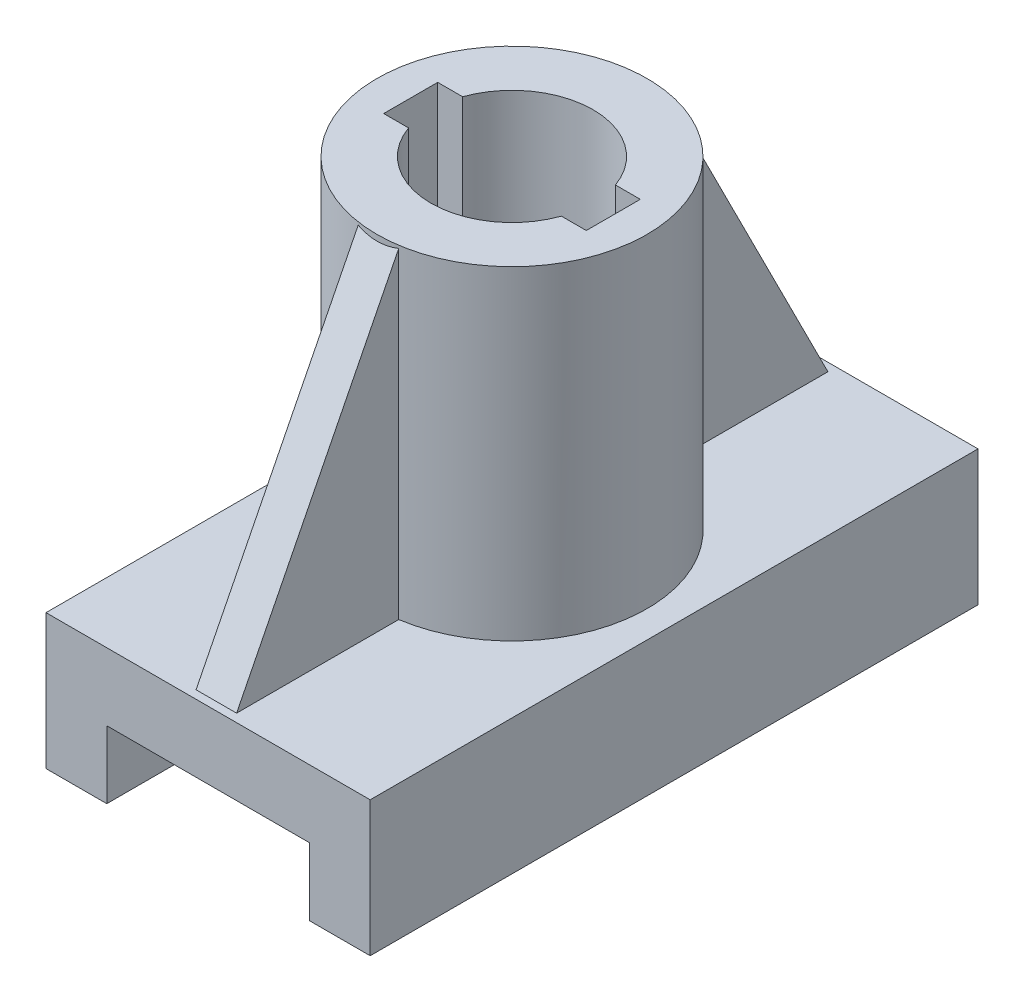
ISO-10303-21;
HEADER;
FILE_DESCRIPTION(('STEP AP214'),'2;1');
FILE_NAME('part.step','',(''),(''),'','','');
FILE_SCHEMA(('AUTOMOTIVE_DESIGN { 1 0 10303 214 1 1 1 1 }'));
ENDSEC;
DATA;
#1=APPLICATION_CONTEXT('core data for automotive mechanical design processes');
#2=APPLICATION_PROTOCOL_DEFINITION('international standard','automotive_design',2000,#1);
#3=PRODUCT_CONTEXT('',#1,'mechanical');
#4=PRODUCT('Part','Part','',(#3));
#5=PRODUCT_RELATED_PRODUCT_CATEGORY('part','',(#4));
#6=PRODUCT_DEFINITION_FORMATION('','',#4);
#7=PRODUCT_DEFINITION_CONTEXT('part definition',#1,'design');
#8=PRODUCT_DEFINITION('design','',#6,#7);
#9=PRODUCT_DEFINITION_SHAPE('','',#8);
#10=(LENGTH_UNIT() NAMED_UNIT(*) SI_UNIT(.MILLI.,.METRE.));
#11=(NAMED_UNIT(*) PLANE_ANGLE_UNIT() SI_UNIT($,.RADIAN.));
#12=(NAMED_UNIT(*) SI_UNIT($,.STERADIAN.) SOLID_ANGLE_UNIT());
#13=UNCERTAINTY_MEASURE_WITH_UNIT(LENGTH_MEASURE(1.E-05),#10,'distance_accuracy_value','');
#14=(GEOMETRIC_REPRESENTATION_CONTEXT(3) GLOBAL_UNCERTAINTY_ASSIGNED_CONTEXT((#13)) GLOBAL_UNIT_ASSIGNED_CONTEXT((#10,
#11,#12)) REPRESENTATION_CONTEXT('',''));
#15=CARTESIAN_POINT('',(0.,0.,0.));
#16=DIRECTION('',(0.,0.,1.));
#17=DIRECTION('',(1.,0.,0.));
#18=AXIS2_PLACEMENT_3D('',#15,#16,#17);
#19=CARTESIAN_POINT('',(-24.,20.,-90.));
#20=DIRECTION('',(0.,1.,0.));
#21=DIRECTION('',(0.,0.,1.));
#22=AXIS2_PLACEMENT_3D('',#19,#20,#21);
#23=PLANE('',#22);
#24=DIRECTION('',(0.,0.,-1.));
#25=VECTOR('',#24,1.);
#26=CARTESIAN_POINT('',(3.,20.,-90.));
#27=LINE('',#26,#25);
#28=CARTESIAN_POINT('',(3.,20.,-1.21969792236601));
#29=VERTEX_POINT('',#28);
#30=CARTESIAN_POINT('',(3.,20.,-25.2262800667148));
#31=VERTEX_POINT('',#30);
#32=EDGE_CURVE('E220',#29,#31,#27,.T.);
#33=ORIENTED_EDGE('',*,*,#32,.F.);
#34=DIRECTION('',(1.,0.,0.));
#35=VECTOR('',#34,1.);
#36=CARTESIAN_POINT('',(-24.,20.,-1.21969792236601));
#37=LINE('',#36,#35);
#38=CARTESIAN_POINT('',(-3.,20.,-1.21969792236601));
#39=VERTEX_POINT('',#38);
#40=EDGE_CURVE('E223',#39,#29,#37,.T.);
#41=ORIENTED_EDGE('',*,*,#40,.F.);
#42=DIRECTION('',(0.,0.,-1.));
#43=VECTOR('',#42,1.);
#44=CARTESIAN_POINT('',(-3.,20.,-90.));
#45=LINE('',#44,#43);
#46=CARTESIAN_POINT('',(-3.,20.,-25.2262800667148));
#47=VERTEX_POINT('',#46);
#48=EDGE_CURVE('E214',#39,#47,#45,.T.);
#49=ORIENTED_EDGE('',*,*,#48,.T.);
#50=CARTESIAN_POINT('',(0.,20.,-45.));
#51=DIRECTION('',(0.,1.,0.));
#52=DIRECTION('',(0.,0.,1.));
#53=AXIS2_PLACEMENT_3D('',#50,#51,#52);
#54=CIRCLE('',#53,20.);
#55=CARTESIAN_POINT('',(-3.,20.,-64.7737199332852));
#56=VERTEX_POINT('',#55);
#57=EDGE_CURVE('E284',#56,#47,#54,.T.);
#58=ORIENTED_EDGE('',*,*,#57,.F.);
#59=DIRECTION('',(0.,0.,-1.));
#60=VECTOR('',#59,1.);
#61=CARTESIAN_POINT('',(-3.,20.,-90.));
#62=LINE('',#61,#60);
#63=CARTESIAN_POINT('',(-3.,20.,-88.7781687578126));
#64=VERTEX_POINT('',#63);
#65=EDGE_CURVE('E55',#56,#64,#62,.T.);
#66=ORIENTED_EDGE('',*,*,#65,.T.);
#67=DIRECTION('',(1.,0.,0.));
#68=VECTOR('',#67,1.);
#69=CARTESIAN_POINT('',(-24.,20.,-88.7781687578126));
#70=LINE('',#69,#68);
#71=CARTESIAN_POINT('',(3.,20.,-88.7781687578126));
#72=VERTEX_POINT('',#71);
#73=EDGE_CURVE('E50',#72,#64,#70,.F.);
#74=ORIENTED_EDGE('',*,*,#73,.F.);
#75=DIRECTION('',(0.,0.,-1.));
#76=VECTOR('',#75,1.);
#77=CARTESIAN_POINT('',(3.,20.,-90.));
#78=LINE('',#77,#76);
#79=CARTESIAN_POINT('',(3.,20.,-64.7737199332852));
#80=VERTEX_POINT('',#79);
#81=EDGE_CURVE('E203',#80,#72,#78,.T.);
#82=ORIENTED_EDGE('',*,*,#81,.F.);
#83=EDGE_CURVE('E289',#31,#80,#54,.T.);
#84=ORIENTED_EDGE('',*,*,#83,.F.);
#85=EDGE_LOOP('',(#33,#41,#49,#58,#66,#74,#82,#84));
#86=FACE_BOUND('',#85,.T.);
#87=DIRECTION('',(0.,0.,1.));
#88=VECTOR('',#87,1.);
#89=CARTESIAN_POINT('',(-24.,20.,-90.));
#90=LINE('',#89,#88);
#91=CARTESIAN_POINT('',(-24.,20.,-90.));
#92=VERTEX_POINT('',#91);
#93=CARTESIAN_POINT('',(-24.,20.,0.));
#94=VERTEX_POINT('',#93);
#95=EDGE_CURVE('E341',#92,#94,#90,.T.);
#96=ORIENTED_EDGE('',*,*,#95,.T.);
#97=DIRECTION('',(-1.,0.,0.));
#98=VECTOR('',#97,1.);
#99=CARTESIAN_POINT('',(-24.,20.,0.));
#100=LINE('',#99,#98);
#101=CARTESIAN_POINT('',(24.,20.,0.));
#102=VERTEX_POINT('',#101);
#103=EDGE_CURVE('E325',#102,#94,#100,.T.);
#104=ORIENTED_EDGE('',*,*,#103,.F.);
#105=DIRECTION('',(0.,0.,1.));
#106=VECTOR('',#105,1.);
#107=CARTESIAN_POINT('',(24.,20.,-90.));
#108=LINE('',#107,#106);
#109=CARTESIAN_POINT('',(24.,20.,-90.));
#110=VERTEX_POINT('',#109);
#111=EDGE_CURVE('E344',#110,#102,#108,.T.);
#112=ORIENTED_EDGE('',*,*,#111,.F.);
#113=DIRECTION('',(-1.,0.,0.));
#114=VECTOR('',#113,1.);
#115=CARTESIAN_POINT('',(-24.,20.,-90.));
#116=LINE('',#115,#114);
#117=EDGE_CURVE('E303',#110,#92,#116,.T.);
#118=ORIENTED_EDGE('',*,*,#117,.T.);
#119=EDGE_LOOP('',(#96,#104,#112,#118));
#120=FACE_BOUND('',#119,.T.);
#121=ADVANCED_FACE('F35',(#86,#120),#23,.T.);
#122=CARTESIAN_POINT('',(-15.,10.,-90.));
#123=DIRECTION('',(0.,-1.,0.));
#124=DIRECTION('',(0.,0.,-1.));
#125=AXIS2_PLACEMENT_3D('',#122,#123,#124);
#126=PLANE('',#125);
#127=DIRECTION('',(0.,0.,1.));
#128=VECTOR('',#127,1.);
#129=CARTESIAN_POINT('',(15.,10.,-90.));
#130=LINE('',#129,#128);
#131=CARTESIAN_POINT('',(15.,10.,-90.));
#132=VERTEX_POINT('',#131);
#133=CARTESIAN_POINT('',(15.,10.,0.));
#134=VERTEX_POINT('',#133);
#135=EDGE_CURVE('E314',#132,#134,#130,.T.);
#136=ORIENTED_EDGE('',*,*,#135,.T.);
#137=DIRECTION('',(1.,0.,0.));
#138=VECTOR('',#137,1.);
#139=CARTESIAN_POINT('',(-15.,10.,0.));
#140=LINE('',#139,#138);
#141=CARTESIAN_POINT('',(-15.,10.,0.));
#142=VERTEX_POINT('',#141);
#143=EDGE_CURVE('E288',#142,#134,#140,.T.);
#144=ORIENTED_EDGE('',*,*,#143,.F.);
#145=DIRECTION('',(0.,0.,1.));
#146=VECTOR('',#145,1.);
#147=CARTESIAN_POINT('',(-15.,10.,-90.));
#148=LINE('',#147,#146);
#149=CARTESIAN_POINT('',(-15.,10.,-90.));
#150=VERTEX_POINT('',#149);
#151=EDGE_CURVE('E335',#150,#142,#148,.T.);
#152=ORIENTED_EDGE('',*,*,#151,.F.);
#153=DIRECTION('',(1.,0.,0.));
#154=VECTOR('',#153,1.);
#155=CARTESIAN_POINT('',(-15.,10.,-90.));
#156=LINE('',#155,#154);
#157=EDGE_CURVE('E291',#150,#132,#156,.T.);
#158=ORIENTED_EDGE('',*,*,#157,.T.);
#159=EDGE_LOOP('',(#136,#144,#152,#158));
#160=FACE_BOUND('',#159,.T.);
#161=ADVANCED_FACE('F37',(#160),#126,.T.);
#162=CARTESIAN_POINT('',(-15.,0.,-90.));
#163=DIRECTION('',(1.,0.,0.));
#164=DIRECTION('',(0.,0.,-1.));
#165=AXIS2_PLACEMENT_3D('',#162,#163,#164);
#166=PLANE('',#165);
#167=DIRECTION('',(0.,1.,0.));
#168=VECTOR('',#167,1.);
#169=CARTESIAN_POINT('',(-15.,0.,0.));
#170=LINE('',#169,#168);
#171=CARTESIAN_POINT('',(-15.,0.,0.));
#172=VERTEX_POINT('',#171);
#173=EDGE_CURVE('E294',#172,#142,#170,.T.);
#174=ORIENTED_EDGE('',*,*,#173,.F.);
#175=DIRECTION('',(0.,0.,1.));
#176=VECTOR('',#175,1.);
#177=CARTESIAN_POINT('',(-15.,0.,-90.));
#178=LINE('',#177,#176);
#179=CARTESIAN_POINT('',(-15.,0.,-90.));
#180=VERTEX_POINT('',#179);
#181=EDGE_CURVE('E337',#180,#172,#178,.T.);
#182=ORIENTED_EDGE('',*,*,#181,.F.);
#183=DIRECTION('',(0.,1.,0.));
#184=VECTOR('',#183,1.);
#185=CARTESIAN_POINT('',(-15.,0.,-90.));
#186=LINE('',#185,#184);
#187=EDGE_CURVE('E311',#180,#150,#186,.T.);
#188=ORIENTED_EDGE('',*,*,#187,.T.);
#189=ORIENTED_EDGE('',*,*,#151,.T.);
#190=EDGE_LOOP('',(#174,#182,#188,#189));
#191=FACE_BOUND('',#190,.T.);
#192=ADVANCED_FACE('F380',(#191),#166,.T.);
#193=CARTESIAN_POINT('',(-15.,0.,-90.));
#194=DIRECTION('',(0.,-1.,0.));
#195=DIRECTION('',(1.,0.,0.));
#196=AXIS2_PLACEMENT_3D('',#193,#194,#195);
#197=PLANE('',#196);
#198=DIRECTION('',(1.,0.,0.));
#199=VECTOR('',#198,1.);
#200=CARTESIAN_POINT('',(-15.,0.,0.));
#201=LINE('',#200,#199);
#202=CARTESIAN_POINT('',(-24.,0.,0.));
#203=VERTEX_POINT('',#202);
#204=EDGE_CURVE('E330',#203,#172,#201,.T.);
#205=ORIENTED_EDGE('',*,*,#204,.F.);
#206=DIRECTION('',(0.,0.,1.));
#207=VECTOR('',#206,1.);
#208=CARTESIAN_POINT('',(-24.,0.,-90.));
#209=LINE('',#208,#207);
#210=CARTESIAN_POINT('',(-24.,0.,-90.));
#211=VERTEX_POINT('',#210);
#212=EDGE_CURVE('E339',#211,#203,#209,.T.);
#213=ORIENTED_EDGE('',*,*,#212,.F.);
#214=DIRECTION('',(1.,0.,0.));
#215=VECTOR('',#214,1.);
#216=CARTESIAN_POINT('',(-15.,0.,-90.));
#217=LINE('',#216,#215);
#218=EDGE_CURVE('E308',#211,#180,#217,.T.);
#219=ORIENTED_EDGE('',*,*,#218,.T.);
#220=ORIENTED_EDGE('',*,*,#181,.T.);
#221=EDGE_LOOP('',(#205,#213,#219,#220));
#222=FACE_BOUND('',#221,.T.);
#223=ADVANCED_FACE('F462',(#222),#197,.T.);
#224=CARTESIAN_POINT('',(-24.,0.,-90.));
#225=DIRECTION('',(-1.,0.,0.));
#226=DIRECTION('',(0.,0.,1.));
#227=AXIS2_PLACEMENT_3D('',#224,#225,#226);
#228=PLANE('',#227);
#229=DIRECTION('',(0.,-1.,0.));
#230=VECTOR('',#229,1.);
#231=CARTESIAN_POINT('',(-24.,0.,0.));
#232=LINE('',#231,#230);
#233=EDGE_CURVE('E327',#94,#203,#232,.T.);
#234=ORIENTED_EDGE('',*,*,#233,.F.);
#235=ORIENTED_EDGE('',*,*,#95,.F.);
#236=DIRECTION('',(0.,-1.,0.));
#237=VECTOR('',#236,1.);
#238=CARTESIAN_POINT('',(-24.,0.,-90.));
#239=LINE('',#238,#237);
#240=EDGE_CURVE('E305',#92,#211,#239,.T.);
#241=ORIENTED_EDGE('',*,*,#240,.T.);
#242=ORIENTED_EDGE('',*,*,#212,.T.);
#243=EDGE_LOOP('',(#234,#235,#241,#242));
#244=FACE_BOUND('',#243,.T.);
#245=ADVANCED_FACE('F465',(#244),#228,.T.);
#246=CARTESIAN_POINT('',(24.,20.,-90.));
#247=DIRECTION('',(1.,0.,0.));
#248=DIRECTION('',(0.,0.,-1.));
#249=AXIS2_PLACEMENT_3D('',#246,#247,#248);
#250=PLANE('',#249);
#251=DIRECTION('',(0.,1.,0.));
#252=VECTOR('',#251,1.);
#253=CARTESIAN_POINT('',(24.,20.,0.));
#254=LINE('',#253,#252);
#255=CARTESIAN_POINT('',(24.,0.,0.));
#256=VERTEX_POINT('',#255);
#257=EDGE_CURVE('E322',#256,#102,#254,.T.);
#258=ORIENTED_EDGE('',*,*,#257,.F.);
#259=DIRECTION('',(0.,0.,1.));
#260=VECTOR('',#259,1.);
#261=CARTESIAN_POINT('',(24.,0.,-90.));
#262=LINE('',#261,#260);
#263=CARTESIAN_POINT('',(24.,0.,-90.));
#264=VERTEX_POINT('',#263);
#265=EDGE_CURVE('E346',#264,#256,#262,.T.);
#266=ORIENTED_EDGE('',*,*,#265,.F.);
#267=DIRECTION('',(0.,1.,0.));
#268=VECTOR('',#267,1.);
#269=CARTESIAN_POINT('',(24.,20.,-90.));
#270=LINE('',#269,#268);
#271=EDGE_CURVE('E300',#264,#110,#270,.T.);
#272=ORIENTED_EDGE('',*,*,#271,.T.);
#273=ORIENTED_EDGE('',*,*,#111,.T.);
#274=EDGE_LOOP('',(#258,#266,#272,#273));
#275=FACE_BOUND('',#274,.T.);
#276=ADVANCED_FACE('F468',(#275),#250,.T.);
#277=CARTESIAN_POINT('',(24.,0.,-90.));
#278=DIRECTION('',(0.,-1.,0.));
#279=DIRECTION('',(1.,0.,0.));
#280=AXIS2_PLACEMENT_3D('',#277,#278,#279);
#281=PLANE('',#280);
#282=DIRECTION('',(1.,0.,0.));
#283=VECTOR('',#282,1.);
#284=CARTESIAN_POINT('',(24.,0.,0.));
#285=LINE('',#284,#283);
#286=CARTESIAN_POINT('',(15.,0.,0.));
#287=VERTEX_POINT('',#286);
#288=EDGE_CURVE('E319',#287,#256,#285,.T.);
#289=ORIENTED_EDGE('',*,*,#288,.F.);
#290=DIRECTION('',(0.,0.,1.));
#291=VECTOR('',#290,1.);
#292=CARTESIAN_POINT('',(15.,0.,-90.));
#293=LINE('',#292,#291);
#294=CARTESIAN_POINT('',(15.,0.,-90.));
#295=VERTEX_POINT('',#294);
#296=EDGE_CURVE('E348',#295,#287,#293,.T.);
#297=ORIENTED_EDGE('',*,*,#296,.F.);
#298=DIRECTION('',(1.,0.,0.));
#299=VECTOR('',#298,1.);
#300=CARTESIAN_POINT('',(24.,0.,-90.));
#301=LINE('',#300,#299);
#302=EDGE_CURVE('E297',#295,#264,#301,.T.);
#303=ORIENTED_EDGE('',*,*,#302,.T.);
#304=ORIENTED_EDGE('',*,*,#265,.T.);
#305=EDGE_LOOP('',(#289,#297,#303,#304));
#306=FACE_BOUND('',#305,.T.);
#307=ADVANCED_FACE('F473',(#306),#281,.T.);
#308=CARTESIAN_POINT('',(15.,10.,-90.));
#309=DIRECTION('',(-1.,0.,0.));
#310=DIRECTION('',(0.,0.,1.));
#311=AXIS2_PLACEMENT_3D('',#308,#309,#310);
#312=PLANE('',#311);
#313=DIRECTION('',(0.,-1.,0.));
#314=VECTOR('',#313,1.);
#315=CARTESIAN_POINT('',(15.,10.,0.));
#316=LINE('',#315,#314);
#317=EDGE_CURVE('E316',#134,#287,#316,.T.);
#318=ORIENTED_EDGE('',*,*,#317,.F.);
#319=ORIENTED_EDGE('',*,*,#135,.F.);
#320=DIRECTION('',(0.,-1.,0.));
#321=VECTOR('',#320,1.);
#322=CARTESIAN_POINT('',(15.,10.,-90.));
#323=LINE('',#322,#321);
#324=EDGE_CURVE('E293',#132,#295,#323,.T.);
#325=ORIENTED_EDGE('',*,*,#324,.T.);
#326=ORIENTED_EDGE('',*,*,#296,.T.);
#327=EDGE_LOOP('',(#318,#319,#325,#326));
#328=FACE_BOUND('',#327,.T.);
#329=ADVANCED_FACE('F455',(#328),#312,.T.);
#330=CARTESIAN_POINT('',(0.,0.,-90.));
#331=DIRECTION('',(0.,0.,-1.));
#332=DIRECTION('',(-1.,0.,0.));
#333=AXIS2_PLACEMENT_3D('',#330,#331,#332);
#334=PLANE('',#333);
#335=ORIENTED_EDGE('',*,*,#324,.F.);
#336=ORIENTED_EDGE('',*,*,#157,.F.);
#337=ORIENTED_EDGE('',*,*,#187,.F.);
#338=ORIENTED_EDGE('',*,*,#218,.F.);
#339=ORIENTED_EDGE('',*,*,#240,.F.);
#340=ORIENTED_EDGE('',*,*,#117,.F.);
#341=ORIENTED_EDGE('',*,*,#271,.F.);
#342=ORIENTED_EDGE('',*,*,#302,.F.);
#343=EDGE_LOOP('',(#335,#336,#337,#338,#339,#340,#341,#342));
#344=FACE_BOUND('',#343,.T.);
#345=ADVANCED_FACE('F452',(#344),#334,.T.);
#346=CARTESIAN_POINT('',(0.,0.,0.));
#347=DIRECTION('',(0.,0.,-1.));
#348=DIRECTION('',(-1.,0.,0.));
#349=AXIS2_PLACEMENT_3D('',#346,#347,#348);
#350=PLANE('',#349);
#351=ORIENTED_EDGE('',*,*,#103,.T.);
#352=ORIENTED_EDGE('',*,*,#233,.T.);
#353=ORIENTED_EDGE('',*,*,#204,.T.);
#354=ORIENTED_EDGE('',*,*,#173,.T.);
#355=ORIENTED_EDGE('',*,*,#143,.T.);
#356=ORIENTED_EDGE('',*,*,#317,.T.);
#357=ORIENTED_EDGE('',*,*,#288,.T.);
#358=ORIENTED_EDGE('',*,*,#257,.T.);
#359=EDGE_LOOP('',(#351,#352,#353,#354,#355,#356,#357,#358));
#360=FACE_BOUND('',#359,.T.);
#361=ADVANCED_FACE('F449',(#360),#350,.F.);
#362=CARTESIAN_POINT('',(0.,68.,-45.));
#363=DIRECTION('',(0.,1.,0.));
#364=DIRECTION('',(0.,0.,1.));
#365=AXIS2_PLACEMENT_3D('',#362,#363,#364);
#366=PLANE('',#365);
#367=DIRECTION('',(1.,0.,0.));
#368=VECTOR('',#367,1.);
#369=CARTESIAN_POINT('',(15.,68.,-41.));
#370=LINE('',#369,#368);
#371=CARTESIAN_POINT('',(11.3137084989848,68.,-41.));
#372=VERTEX_POINT('',#371);
#373=CARTESIAN_POINT('',(15.,68.,-41.));
#374=VERTEX_POINT('',#373);
#375=EDGE_CURVE('E230',#372,#374,#370,.T.);
#376=ORIENTED_EDGE('',*,*,#375,.F.);
#377=CARTESIAN_POINT('',(0.,68.,-45.));
#378=DIRECTION('',(0.,1.,0.));
#379=DIRECTION('',(0.,0.,1.));
#380=AXIS2_PLACEMENT_3D('',#377,#378,#379);
#381=CIRCLE('',#380,12.);
#382=CARTESIAN_POINT('',(-11.3137084989848,68.,-41.));
#383=VERTEX_POINT('',#382);
#384=EDGE_CURVE('E228',#383,#372,#381,.T.);
#385=ORIENTED_EDGE('',*,*,#384,.F.);
#386=DIRECTION('',(1.,0.,0.));
#387=VECTOR('',#386,1.);
#388=CARTESIAN_POINT('',(-11.3137084989848,68.,-41.));
#389=LINE('',#388,#387);
#390=CARTESIAN_POINT('',(-15.,68.,-41.));
#391=VERTEX_POINT('',#390);
#392=EDGE_CURVE('E244',#391,#383,#389,.T.);
#393=ORIENTED_EDGE('',*,*,#392,.F.);
#394=DIRECTION('',(0.,0.,1.));
#395=VECTOR('',#394,1.);
#396=CARTESIAN_POINT('',(-15.,68.,-49.));
#397=LINE('',#396,#395);
#398=CARTESIAN_POINT('',(-15.,68.,-49.));
#399=VERTEX_POINT('',#398);
#400=EDGE_CURVE('E241',#399,#391,#397,.T.);
#401=ORIENTED_EDGE('',*,*,#400,.F.);
#402=DIRECTION('',(-1.,0.,0.));
#403=VECTOR('',#402,1.);
#404=CARTESIAN_POINT('',(-11.3137084989848,68.,-49.));
#405=LINE('',#404,#403);
#406=CARTESIAN_POINT('',(-11.3137084989848,68.,-49.));
#407=VERTEX_POINT('',#406);
#408=EDGE_CURVE('E239',#407,#399,#405,.T.);
#409=ORIENTED_EDGE('',*,*,#408,.F.);
#410=CARTESIAN_POINT('',(0.,68.,-45.));
#411=DIRECTION('',(0.,1.,0.));
#412=DIRECTION('',(0.,0.,1.));
#413=AXIS2_PLACEMENT_3D('',#410,#411,#412);
#414=CIRCLE('',#413,12.);
#415=CARTESIAN_POINT('',(11.3137084989848,68.,-49.));
#416=VERTEX_POINT('',#415);
#417=EDGE_CURVE('E237',#416,#407,#414,.T.);
#418=ORIENTED_EDGE('',*,*,#417,.F.);
#419=DIRECTION('',(-1.,0.,0.));
#420=VECTOR('',#419,1.);
#421=CARTESIAN_POINT('',(15.,68.,-49.));
#422=LINE('',#421,#420);
#423=CARTESIAN_POINT('',(15.,68.,-49.));
#424=VERTEX_POINT('',#423);
#425=EDGE_CURVE('E235',#424,#416,#422,.T.);
#426=ORIENTED_EDGE('',*,*,#425,.F.);
#427=DIRECTION('',(0.,0.,-1.));
#428=VECTOR('',#427,1.);
#429=CARTESIAN_POINT('',(15.,68.,-49.));
#430=LINE('',#429,#428);
#431=EDGE_CURVE('E233',#374,#424,#430,.T.);
#432=ORIENTED_EDGE('',*,*,#431,.F.);
#433=EDGE_LOOP('',(#376,#385,#393,#401,#409,#418,#426,#432));
#434=FACE_BOUND('',#433,.T.);
#435=CARTESIAN_POINT('',(0.,68.,-45.));
#436=DIRECTION('',(0.,1.,0.));
#437=DIRECTION('',(0.,0.,1.));
#438=AXIS2_PLACEMENT_3D('',#435,#436,#437);
#439=CIRCLE('',#438,20.);
#440=CARTESIAN_POINT('',(0.,68.,-25.));
#441=VERTEX_POINT('',#440);
#442=EDGE_CURVE('E285',#441,#441,#439,.T.);
#443=ORIENTED_EDGE('',*,*,#442,.T.);
#444=EDGE_LOOP('',(#443));
#445=FACE_BOUND('',#444,.T.);
#446=ADVANCED_FACE('F420',(#434,#445),#366,.T.);
#447=CARTESIAN_POINT('',(0.,68.,-45.));
#448=DIRECTION('',(0.,-1.,0.));
#449=DIRECTION('',(0.,0.,-1.));
#450=AXIS2_PLACEMENT_3D('',#447,#448,#449);
#451=CYLINDRICAL_SURFACE('',#450,20.);
#452=CARTESIAN_POINT('',(0.,106.769006746177,-45.));
#453=DIRECTION('',(0.,0.450468621637457,0.892792260786377));
#454=DIRECTION('',(0.,-0.892792260786377,0.450468621637457));
#455=AXIS2_PLACEMENT_3D('',#452,#453,#454);
#456=ELLIPSE('',#455,44.3982089746892,20.);
#457=CARTESIAN_POINT('',(-3.,67.579098114533,-25.2262800667148));
#458=VERTEX_POINT('',#457);
#459=CARTESIAN_POINT('',(3.,67.579098114533,-25.2262800667148));
#460=VERTEX_POINT('',#459);
#461=EDGE_CURVE('E43',#458,#460,#456,.T.);
#462=ORIENTED_EDGE('',*,*,#461,.T.);
#463=DIRECTION('',(0.,-1.,0.));
#464=VECTOR('',#463,1.);
#465=CARTESIAN_POINT('',(3.,68.,-25.2262800667148));
#466=LINE('',#465,#464);
#467=EDGE_CURVE('E217',#460,#31,#466,.T.);
#468=ORIENTED_EDGE('',*,*,#467,.T.);
#469=ORIENTED_EDGE('',*,*,#83,.T.);
#470=DIRECTION('',(0.,-1.,0.));
#471=VECTOR('',#470,1.);
#472=CARTESIAN_POINT('',(3.,68.,-64.7737199332852));
#473=LINE('',#472,#471);
#474=CARTESIAN_POINT('',(3.,67.5748700477271,-64.7737199332852));
#475=VERTEX_POINT('',#474);
#476=EDGE_CURVE('E187',#80,#475,#473,.F.);
#477=ORIENTED_EDGE('',*,*,#476,.T.);
#478=CARTESIAN_POINT('',(0.,106.764778679371,-45.));
#479=DIRECTION('',(0.,-0.450468621637457,0.892792260786377));
#480=DIRECTION('',(0.,-0.892792260786377,-0.450468621637457));
#481=AXIS2_PLACEMENT_3D('',#478,#479,#480);
#482=ELLIPSE('',#481,44.3982089746892,20.);
#483=CARTESIAN_POINT('',(-3.,67.5748700477271,-64.7737199332852));
#484=VERTEX_POINT('',#483);
#485=EDGE_CURVE('E11',#475,#484,#482,.F.);
#486=ORIENTED_EDGE('',*,*,#485,.T.);
#487=DIRECTION('',(0.,-1.,0.));
#488=VECTOR('',#487,1.);
#489=CARTESIAN_POINT('',(-3.,68.,-64.7737199332852));
#490=LINE('',#489,#488);
#491=EDGE_CURVE('E184',#56,#484,#490,.F.);
#492=ORIENTED_EDGE('',*,*,#491,.F.);
#493=ORIENTED_EDGE('',*,*,#57,.T.);
#494=DIRECTION('',(0.,-1.,0.));
#495=VECTOR('',#494,1.);
#496=CARTESIAN_POINT('',(-3.,68.,-25.2262800667148));
#497=LINE('',#496,#495);
#498=EDGE_CURVE('E211',#458,#47,#497,.T.);
#499=ORIENTED_EDGE('',*,*,#498,.F.);
#500=EDGE_LOOP('',(#462,#468,#469,#477,#486,#492,#493,#499));
#501=FACE_BOUND('',#500,.T.);
#502=ORIENTED_EDGE('',*,*,#442,.F.);
#503=EDGE_LOOP('',(#502));
#504=FACE_BOUND('',#503,.T.);
#505=ADVANCED_FACE('F182',(#501,#504),#451,.T.);
#506=CARTESIAN_POINT('',(0.,68.,-45.));
#507=DIRECTION('',(0.,-1.,0.));
#508=DIRECTION('',(0.,0.,-1.));
#509=AXIS2_PLACEMENT_3D('',#506,#507,#508);
#510=CYLINDRICAL_SURFACE('',#509,12.);
#511=DIRECTION('',(0.,-1.,0.));
#512=VECTOR('',#511,1.);
#513=CARTESIAN_POINT('',(11.3137084989848,68.,-41.));
#514=LINE('',#513,#512);
#515=CARTESIAN_POINT('',(11.3137084989848,20.,-41.));
#516=VERTEX_POINT('',#515);
#517=EDGE_CURVE('E281',#372,#516,#514,.T.);
#518=ORIENTED_EDGE('',*,*,#517,.T.);
#519=CARTESIAN_POINT('',(0.,20.,-45.));
#520=DIRECTION('',(0.,1.,0.));
#521=DIRECTION('',(0.,0.,1.));
#522=AXIS2_PLACEMENT_3D('',#519,#520,#521);
#523=CIRCLE('',#522,12.);
#524=CARTESIAN_POINT('',(-11.3137084989848,20.,-41.));
#525=VERTEX_POINT('',#524);
#526=EDGE_CURVE('E227',#525,#516,#523,.T.);
#527=ORIENTED_EDGE('',*,*,#526,.F.);
#528=DIRECTION('',(0.,-1.,0.));
#529=VECTOR('',#528,1.);
#530=CARTESIAN_POINT('',(-11.3137084989848,68.,-41.));
#531=LINE('',#530,#529);
#532=EDGE_CURVE('E246',#383,#525,#531,.T.);
#533=ORIENTED_EDGE('',*,*,#532,.F.);
#534=ORIENTED_EDGE('',*,*,#384,.T.);
#535=EDGE_LOOP('',(#518,#527,#533,#534));
#536=FACE_BOUND('',#535,.T.);
#537=ADVANCED_FACE('F414',(#536),#510,.F.);
#538=CARTESIAN_POINT('',(15.,68.,-41.));
#539=DIRECTION('',(0.,0.,-1.));
#540=DIRECTION('',(-1.,0.,0.));
#541=AXIS2_PLACEMENT_3D('',#538,#539,#540);
#542=PLANE('',#541);
#543=DIRECTION('',(1.,0.,0.));
#544=VECTOR('',#543,1.);
#545=CARTESIAN_POINT('',(15.,20.,-41.));
#546=LINE('',#545,#544);
#547=CARTESIAN_POINT('',(15.,20.,-41.));
#548=VERTEX_POINT('',#547);
#549=EDGE_CURVE('E248',#516,#548,#546,.T.);
#550=ORIENTED_EDGE('',*,*,#549,.F.);
#551=ORIENTED_EDGE('',*,*,#517,.F.);
#552=ORIENTED_EDGE('',*,*,#375,.T.);
#553=DIRECTION('',(0.,-1.,0.));
#554=VECTOR('',#553,1.);
#555=CARTESIAN_POINT('',(15.,68.,-41.));
#556=LINE('',#555,#554);
#557=EDGE_CURVE('E278',#374,#548,#556,.T.);
#558=ORIENTED_EDGE('',*,*,#557,.T.);
#559=EDGE_LOOP('',(#550,#551,#552,#558));
#560=FACE_BOUND('',#559,.T.);
#561=ADVANCED_FACE('F424',(#560),#542,.T.);
#562=CARTESIAN_POINT('',(15.,68.,-49.));
#563=DIRECTION('',(-1.,0.,0.));
#564=DIRECTION('',(0.,0.,1.));
#565=AXIS2_PLACEMENT_3D('',#562,#563,#564);
#566=PLANE('',#565);
#567=DIRECTION('',(0.,0.,-1.));
#568=VECTOR('',#567,1.);
#569=CARTESIAN_POINT('',(15.,20.,-49.));
#570=LINE('',#569,#568);
#571=CARTESIAN_POINT('',(15.,20.,-49.));
#572=VERTEX_POINT('',#571);
#573=EDGE_CURVE('E250',#548,#572,#570,.T.);
#574=ORIENTED_EDGE('',*,*,#573,.F.);
#575=ORIENTED_EDGE('',*,*,#557,.F.);
#576=ORIENTED_EDGE('',*,*,#431,.T.);
#577=DIRECTION('',(0.,-1.,0.));
#578=VECTOR('',#577,1.);
#579=CARTESIAN_POINT('',(15.,68.,-49.));
#580=LINE('',#579,#578);
#581=EDGE_CURVE('E275',#424,#572,#580,.T.);
#582=ORIENTED_EDGE('',*,*,#581,.T.);
#583=EDGE_LOOP('',(#574,#575,#576,#582));
#584=FACE_BOUND('',#583,.T.);
#585=ADVANCED_FACE('F429',(#584),#566,.T.);
#586=CARTESIAN_POINT('',(15.,68.,-49.));
#587=DIRECTION('',(0.,0.,1.));
#588=DIRECTION('',(1.,0.,0.));
#589=AXIS2_PLACEMENT_3D('',#586,#587,#588);
#590=PLANE('',#589);
#591=DIRECTION('',(-1.,0.,0.));
#592=VECTOR('',#591,1.);
#593=CARTESIAN_POINT('',(15.,20.,-49.));
#594=LINE('',#593,#592);
#595=CARTESIAN_POINT('',(11.3137084989848,20.,-49.));
#596=VERTEX_POINT('',#595);
#597=EDGE_CURVE('E252',#572,#596,#594,.T.);
#598=ORIENTED_EDGE('',*,*,#597,.F.);
#599=ORIENTED_EDGE('',*,*,#581,.F.);
#600=ORIENTED_EDGE('',*,*,#425,.T.);
#601=DIRECTION('',(0.,-1.,0.));
#602=VECTOR('',#601,1.);
#603=CARTESIAN_POINT('',(11.3137084989848,68.,-49.));
#604=LINE('',#603,#602);
#605=EDGE_CURVE('E272',#416,#596,#604,.T.);
#606=ORIENTED_EDGE('',*,*,#605,.T.);
#607=EDGE_LOOP('',(#598,#599,#600,#606));
#608=FACE_BOUND('',#607,.T.);
#609=ADVANCED_FACE('F432',(#608),#590,.T.);
#610=CARTESIAN_POINT('',(0.,68.,-45.));
#611=DIRECTION('',(0.,-1.,0.));
#612=DIRECTION('',(0.,0.,-1.));
#613=AXIS2_PLACEMENT_3D('',#610,#611,#612);
#614=CYLINDRICAL_SURFACE('',#613,12.);
#615=ORIENTED_EDGE('',*,*,#417,.T.);
#616=DIRECTION('',(0.,-1.,0.));
#617=VECTOR('',#616,1.);
#618=CARTESIAN_POINT('',(-11.3137084989848,68.,-49.));
#619=LINE('',#618,#617);
#620=CARTESIAN_POINT('',(-11.3137084989848,20.,-49.));
#621=VERTEX_POINT('',#620);
#622=EDGE_CURVE('E269',#407,#621,#619,.T.);
#623=ORIENTED_EDGE('',*,*,#622,.T.);
#624=CARTESIAN_POINT('',(0.,20.,-45.));
#625=DIRECTION('',(0.,1.,0.));
#626=DIRECTION('',(0.,0.,1.));
#627=AXIS2_PLACEMENT_3D('',#624,#625,#626);
#628=CIRCLE('',#627,12.);
#629=EDGE_CURVE('E254',#596,#621,#628,.T.);
#630=ORIENTED_EDGE('',*,*,#629,.F.);
#631=ORIENTED_EDGE('',*,*,#605,.F.);
#632=EDGE_LOOP('',(#615,#623,#630,#631));
#633=FACE_BOUND('',#632,.T.);
#634=ADVANCED_FACE('F400',(#633),#614,.F.);
#635=CARTESIAN_POINT('',(-11.3137084989848,68.,-49.));
#636=DIRECTION('',(0.,0.,1.));
#637=DIRECTION('',(1.,0.,0.));
#638=AXIS2_PLACEMENT_3D('',#635,#636,#637);
#639=PLANE('',#638);
#640=DIRECTION('',(-1.,0.,0.));
#641=VECTOR('',#640,1.);
#642=CARTESIAN_POINT('',(-11.3137084989848,20.,-49.));
#643=LINE('',#642,#641);
#644=CARTESIAN_POINT('',(-15.,20.,-49.));
#645=VERTEX_POINT('',#644);
#646=EDGE_CURVE('E256',#621,#645,#643,.T.);
#647=ORIENTED_EDGE('',*,*,#646,.F.);
#648=ORIENTED_EDGE('',*,*,#622,.F.);
#649=ORIENTED_EDGE('',*,*,#408,.T.);
#650=DIRECTION('',(0.,-1.,0.));
#651=VECTOR('',#650,1.);
#652=CARTESIAN_POINT('',(-15.,68.,-49.));
#653=LINE('',#652,#651);
#654=EDGE_CURVE('E266',#399,#645,#653,.T.);
#655=ORIENTED_EDGE('',*,*,#654,.T.);
#656=EDGE_LOOP('',(#647,#648,#649,#655));
#657=FACE_BOUND('',#656,.T.);
#658=ADVANCED_FACE('F404',(#657),#639,.T.);
#659=CARTESIAN_POINT('',(-15.,68.,-49.));
#660=DIRECTION('',(1.,0.,0.));
#661=DIRECTION('',(0.,0.,-1.));
#662=AXIS2_PLACEMENT_3D('',#659,#660,#661);
#663=PLANE('',#662);
#664=DIRECTION('',(0.,0.,1.));
#665=VECTOR('',#664,1.);
#666=CARTESIAN_POINT('',(-15.,20.,-49.));
#667=LINE('',#666,#665);
#668=CARTESIAN_POINT('',(-15.,20.,-41.));
#669=VERTEX_POINT('',#668);
#670=EDGE_CURVE('E258',#645,#669,#667,.T.);
#671=ORIENTED_EDGE('',*,*,#670,.F.);
#672=ORIENTED_EDGE('',*,*,#654,.F.);
#673=ORIENTED_EDGE('',*,*,#400,.T.);
#674=DIRECTION('',(0.,-1.,0.));
#675=VECTOR('',#674,1.);
#676=CARTESIAN_POINT('',(-15.,68.,-41.));
#677=LINE('',#676,#675);
#678=EDGE_CURVE('E263',#391,#669,#677,.T.);
#679=ORIENTED_EDGE('',*,*,#678,.T.);
#680=EDGE_LOOP('',(#671,#672,#673,#679));
#681=FACE_BOUND('',#680,.T.);
#682=ADVANCED_FACE('F391',(#681),#663,.T.);
#683=CARTESIAN_POINT('',(-11.3137084989848,68.,-41.));
#684=DIRECTION('',(0.,0.,-1.));
#685=DIRECTION('',(-1.,0.,0.));
#686=AXIS2_PLACEMENT_3D('',#683,#684,#685);
#687=PLANE('',#686);
#688=DIRECTION('',(1.,0.,0.));
#689=VECTOR('',#688,1.);
#690=CARTESIAN_POINT('',(-11.3137084989848,20.,-41.));
#691=LINE('',#690,#689);
#692=EDGE_CURVE('E231',#669,#525,#691,.T.);
#693=ORIENTED_EDGE('',*,*,#692,.F.);
#694=ORIENTED_EDGE('',*,*,#678,.F.);
#695=ORIENTED_EDGE('',*,*,#392,.T.);
#696=ORIENTED_EDGE('',*,*,#532,.T.);
#697=EDGE_LOOP('',(#693,#694,#695,#696));
#698=FACE_BOUND('',#697,.T.);
#699=ADVANCED_FACE('F385',(#698),#687,.T.);
#700=ORIENTED_EDGE('',*,*,#629,.T.);
#701=ORIENTED_EDGE('',*,*,#646,.T.);
#702=ORIENTED_EDGE('',*,*,#670,.T.);
#703=ORIENTED_EDGE('',*,*,#692,.T.);
#704=ORIENTED_EDGE('',*,*,#526,.T.);
#705=ORIENTED_EDGE('',*,*,#549,.T.);
#706=ORIENTED_EDGE('',*,*,#573,.T.);
#707=ORIENTED_EDGE('',*,*,#597,.T.);
#708=EDGE_LOOP('',(#700,#701,#702,#703,#704,#705,#706,#707));
#709=FACE_BOUND('',#708,.T.);
#710=ADVANCED_FACE('F376',(#709),#23,.T.);
#711=CARTESIAN_POINT('',(0.,67.1264013139918,-24.9978666801787));
#712=DIRECTION('',(0.,0.450468621637457,0.892792260786377));
#713=DIRECTION('',(0.,-0.892792260786377,0.450468621637457));
#714=AXIS2_PLACEMENT_3D('',#711,#712,#713);
#715=PLANE('',#714);
#716=DIRECTION('',(0.,-0.892792260786377,0.450468621637457));
#717=VECTOR('',#716,1.);
#718=CARTESIAN_POINT('',(-3.,67.1264013139918,-24.9978666801787));
#719=LINE('',#718,#717);
#720=EDGE_CURVE('E207',#458,#39,#719,.T.);
#721=ORIENTED_EDGE('',*,*,#720,.T.);
#722=ORIENTED_EDGE('',*,*,#40,.T.);
#723=DIRECTION('',(0.,-0.892792260786377,0.450468621637457));
#724=VECTOR('',#723,1.);
#725=CARTESIAN_POINT('',(3.,67.1264013139918,-24.9978666801787));
#726=LINE('',#725,#724);
#727=EDGE_CURVE('E208',#460,#29,#726,.T.);
#728=ORIENTED_EDGE('',*,*,#727,.F.);
#729=ORIENTED_EDGE('',*,*,#461,.F.);
#730=EDGE_LOOP('',(#721,#722,#728,#729));
#731=FACE_BOUND('',#730,.T.);
#732=ADVANCED_FACE('F359',(#731),#715,.T.);
#733=CARTESIAN_POINT('',(3.,34.,-45.));
#734=DIRECTION('',(1.,0.,0.));
#735=DIRECTION('',(0.,0.,-1.));
#736=AXIS2_PLACEMENT_3D('',#733,#734,#735);
#737=PLANE('',#736);
#738=ORIENTED_EDGE('',*,*,#727,.T.);
#739=ORIENTED_EDGE('',*,*,#32,.T.);
#740=ORIENTED_EDGE('',*,*,#467,.F.);
#741=EDGE_LOOP('',(#738,#739,#740));
#742=FACE_BOUND('',#741,.T.);
#743=ADVANCED_FACE('F358',(#742),#737,.T.);
#744=CARTESIAN_POINT('',(-3.,34.,-45.));
#745=DIRECTION('',(1.,0.,0.));
#746=DIRECTION('',(0.,0.,-1.));
#747=AXIS2_PLACEMENT_3D('',#744,#745,#746);
#748=PLANE('',#747);
#749=ORIENTED_EDGE('',*,*,#48,.F.);
#750=ORIENTED_EDGE('',*,*,#720,.F.);
#751=ORIENTED_EDGE('',*,*,#498,.T.);
#752=EDGE_LOOP('',(#749,#750,#751));
#753=FACE_BOUND('',#752,.T.);
#754=ADVANCED_FACE('F363',(#753),#748,.F.);
#755=CARTESIAN_POINT('',(0.,67.1264013139918,-65.));
#756=DIRECTION('',(0.,-0.450468621637457,0.892792260786377));
#757=DIRECTION('',(0.,-0.892792260786377,-0.450468621637457));
#758=AXIS2_PLACEMENT_3D('',#755,#756,#757);
#759=PLANE('',#758);
#760=DIRECTION('',(0.,-0.892792260786377,-0.450468621637457));
#761=VECTOR('',#760,1.);
#762=CARTESIAN_POINT('',(3.,67.1264013139918,-65.));
#763=LINE('',#762,#761);
#764=EDGE_CURVE('E196',#475,#72,#763,.T.);
#765=ORIENTED_EDGE('',*,*,#764,.T.);
#766=ORIENTED_EDGE('',*,*,#73,.T.);
#767=DIRECTION('',(0.,-0.892792260786377,-0.450468621637457));
#768=VECTOR('',#767,1.);
#769=CARTESIAN_POINT('',(-3.,67.1264013139918,-65.));
#770=LINE('',#769,#768);
#771=EDGE_CURVE('E195',#484,#64,#770,.T.);
#772=ORIENTED_EDGE('',*,*,#771,.F.);
#773=ORIENTED_EDGE('',*,*,#485,.F.);
#774=EDGE_LOOP('',(#765,#766,#772,#773));
#775=FACE_BOUND('',#774,.T.);
#776=ADVANCED_FACE('F198',(#775),#759,.F.);
#777=CARTESIAN_POINT('',(3.,34.,-45.));
#778=DIRECTION('',(1.,0.,0.));
#779=DIRECTION('',(0.,0.,-1.));
#780=AXIS2_PLACEMENT_3D('',#777,#778,#779);
#781=PLANE('',#780);
#782=ORIENTED_EDGE('',*,*,#476,.F.);
#783=ORIENTED_EDGE('',*,*,#81,.T.);
#784=ORIENTED_EDGE('',*,*,#764,.F.);
#785=EDGE_LOOP('',(#782,#783,#784));
#786=FACE_BOUND('',#785,.T.);
#787=ADVANCED_FACE('F370',(#786),#781,.T.);
#788=CARTESIAN_POINT('',(-3.,34.,-45.));
#789=DIRECTION('',(1.,0.,0.));
#790=DIRECTION('',(0.,0.,-1.));
#791=AXIS2_PLACEMENT_3D('',#788,#789,#790);
#792=PLANE('',#791);
#793=ORIENTED_EDGE('',*,*,#65,.F.);
#794=ORIENTED_EDGE('',*,*,#491,.T.);
#795=ORIENTED_EDGE('',*,*,#771,.T.);
#796=EDGE_LOOP('',(#793,#794,#795));
#797=FACE_BOUND('',#796,.T.);
#798=ADVANCED_FACE('F194',(#797),#792,.F.);
#799=CLOSED_SHELL('',(#121,#161,#192,#223,#245,#276,#307,#329,#345,#361,#446,#505,#537,#561,
#585,#609,#634,#658,#682,#699,#710,#732,#743,#754,#776,#787,#798));
#800=MANIFOLD_SOLID_BREP('B2',#799);
#801=ADVANCED_BREP_SHAPE_REPRESENTATION('',(#18,#800),#14);
#802=SHAPE_DEFINITION_REPRESENTATION(#9,#801);
ENDSEC;
END-ISO-10303-21;
